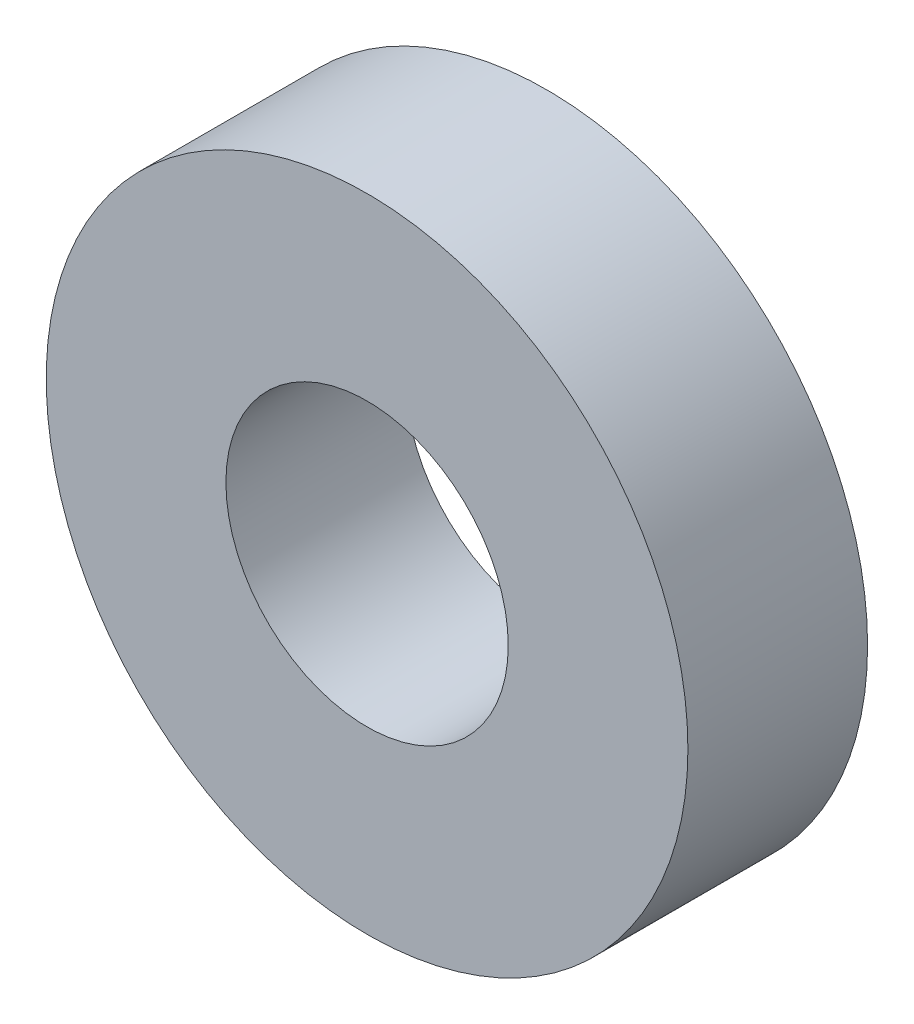
ISO-10303-21;
HEADER;
FILE_DESCRIPTION(('STEP AP214'),'2;1');
FILE_NAME('part.step','',(''),(''),'','','');
FILE_SCHEMA(('AUTOMOTIVE_DESIGN { 1 0 10303 214 1 1 1 1 }'));
ENDSEC;
DATA;
#1=APPLICATION_CONTEXT('core data for automotive mechanical design processes');
#2=APPLICATION_PROTOCOL_DEFINITION('international standard','automotive_design',2000,#1);
#3=PRODUCT_CONTEXT('',#1,'mechanical');
#4=PRODUCT('Part','Part','',(#3));
#5=PRODUCT_RELATED_PRODUCT_CATEGORY('part','',(#4));
#6=PRODUCT_DEFINITION_FORMATION('','',#4);
#7=PRODUCT_DEFINITION_CONTEXT('part definition',#1,'design');
#8=PRODUCT_DEFINITION('design','',#6,#7);
#9=PRODUCT_DEFINITION_SHAPE('','',#8);
#10=(LENGTH_UNIT() NAMED_UNIT(*) SI_UNIT(.MILLI.,.METRE.));
#11=(NAMED_UNIT(*) PLANE_ANGLE_UNIT() SI_UNIT($,.RADIAN.));
#12=(NAMED_UNIT(*) SI_UNIT($,.STERADIAN.) SOLID_ANGLE_UNIT());
#13=UNCERTAINTY_MEASURE_WITH_UNIT(LENGTH_MEASURE(1.E-05),#10,'distance_accuracy_value','');
#14=(GEOMETRIC_REPRESENTATION_CONTEXT(3) GLOBAL_UNCERTAINTY_ASSIGNED_CONTEXT((#13)) GLOBAL_UNIT_ASSIGNED_CONTEXT((#10,
#11,#12)) REPRESENTATION_CONTEXT('',''));
#15=CARTESIAN_POINT('',(0.,0.,0.));
#16=DIRECTION('',(0.,0.,1.));
#17=DIRECTION('',(1.,0.,0.));
#18=AXIS2_PLACEMENT_3D('',#15,#16,#17);
#19=CARTESIAN_POINT('',(0.,0.,14.));
#20=DIRECTION('',(0.,0.,1.));
#21=DIRECTION('',(1.,0.,0.));
#22=AXIS2_PLACEMENT_3D('',#19,#20,#21);
#23=PLANE('',#22);
#24=CARTESIAN_POINT('',(0.,0.,14.));
#25=DIRECTION('',(0.,0.,1.));
#26=DIRECTION('',(1.,0.,0.));
#27=AXIS2_PLACEMENT_3D('',#24,#25,#26);
#28=CIRCLE('',#27,25.);
#29=CARTESIAN_POINT('',(25.,0.,14.));
#30=VERTEX_POINT('',#29);
#31=EDGE_CURVE('E10',#30,#30,#28,.T.);
#32=ORIENTED_EDGE('',*,*,#31,.T.);
#33=EDGE_LOOP('',(#32));
#34=FACE_BOUND('',#33,.T.);
#35=CARTESIAN_POINT('',(0.,0.,14.));
#36=DIRECTION('',(0.,0.,1.));
#37=DIRECTION('',(1.,0.,0.));
#38=AXIS2_PLACEMENT_3D('',#35,#36,#37);
#39=CIRCLE('',#38,11.);
#40=CARTESIAN_POINT('',(11.,0.,14.));
#41=VERTEX_POINT('',#40);
#42=EDGE_CURVE('E42',#41,#41,#39,.T.);
#43=ORIENTED_EDGE('',*,*,#42,.F.);
#44=EDGE_LOOP('',(#43));
#45=FACE_BOUND('',#44,.T.);
#46=ADVANCED_FACE('F31',(#34,#45),#23,.T.);
#47=CARTESIAN_POINT('',(0.,0.,0.));
#48=DIRECTION('',(0.,0.,1.));
#49=DIRECTION('',(1.,0.,0.));
#50=AXIS2_PLACEMENT_3D('',#47,#48,#49);
#51=PLANE('',#50);
#52=CARTESIAN_POINT('',(0.,0.,0.));
#53=DIRECTION('',(0.,0.,1.));
#54=DIRECTION('',(1.,0.,0.));
#55=AXIS2_PLACEMENT_3D('',#52,#53,#54);
#56=CIRCLE('',#55,25.);
#57=CARTESIAN_POINT('',(25.,0.,0.));
#58=VERTEX_POINT('',#57);
#59=EDGE_CURVE('E35',#58,#58,#56,.T.);
#60=ORIENTED_EDGE('',*,*,#59,.F.);
#61=EDGE_LOOP('',(#60));
#62=FACE_BOUND('',#61,.T.);
#63=CARTESIAN_POINT('',(0.,0.,0.));
#64=DIRECTION('',(0.,0.,1.));
#65=DIRECTION('',(1.,0.,0.));
#66=AXIS2_PLACEMENT_3D('',#63,#64,#65);
#67=CIRCLE('',#66,11.);
#68=CARTESIAN_POINT('',(11.,0.,0.));
#69=VERTEX_POINT('',#68);
#70=EDGE_CURVE('E44',#69,#69,#67,.T.);
#71=ORIENTED_EDGE('',*,*,#70,.T.);
#72=EDGE_LOOP('',(#71));
#73=FACE_BOUND('',#72,.T.);
#74=ADVANCED_FACE('F54',(#62,#73),#51,.F.);
#75=CARTESIAN_POINT('',(0.,0.,14.));
#76=DIRECTION('',(0.,0.,-1.));
#77=DIRECTION('',(-1.,0.,0.));
#78=AXIS2_PLACEMENT_3D('',#75,#76,#77);
#79=CYLINDRICAL_SURFACE('',#78,25.);
#80=ORIENTED_EDGE('',*,*,#31,.F.);
#81=EDGE_LOOP('',(#80));
#82=FACE_BOUND('',#81,.T.);
#83=ORIENTED_EDGE('',*,*,#59,.T.);
#84=EDGE_LOOP('',(#83));
#85=FACE_BOUND('',#84,.T.);
#86=ADVANCED_FACE('F33',(#82,#85),#79,.T.);
#87=CARTESIAN_POINT('',(0.,0.,14.));
#88=DIRECTION('',(0.,0.,-1.));
#89=DIRECTION('',(-1.,0.,0.));
#90=AXIS2_PLACEMENT_3D('',#87,#88,#89);
#91=CYLINDRICAL_SURFACE('',#90,11.);
#92=ORIENTED_EDGE('',*,*,#42,.T.);
#93=EDGE_LOOP('',(#92));
#94=FACE_BOUND('',#93,.T.);
#95=ORIENTED_EDGE('',*,*,#70,.F.);
#96=EDGE_LOOP('',(#95));
#97=FACE_BOUND('',#96,.T.);
#98=ADVANCED_FACE('F50',(#94,#97),#91,.F.);
#99=CLOSED_SHELL('',(#46,#74,#86,#98));
#100=MANIFOLD_SOLID_BREP('B2',#99);
#101=ADVANCED_BREP_SHAPE_REPRESENTATION('',(#18,#100),#14);
#102=SHAPE_DEFINITION_REPRESENTATION(#9,#101);
ENDSEC;
END-ISO-10303-21;
